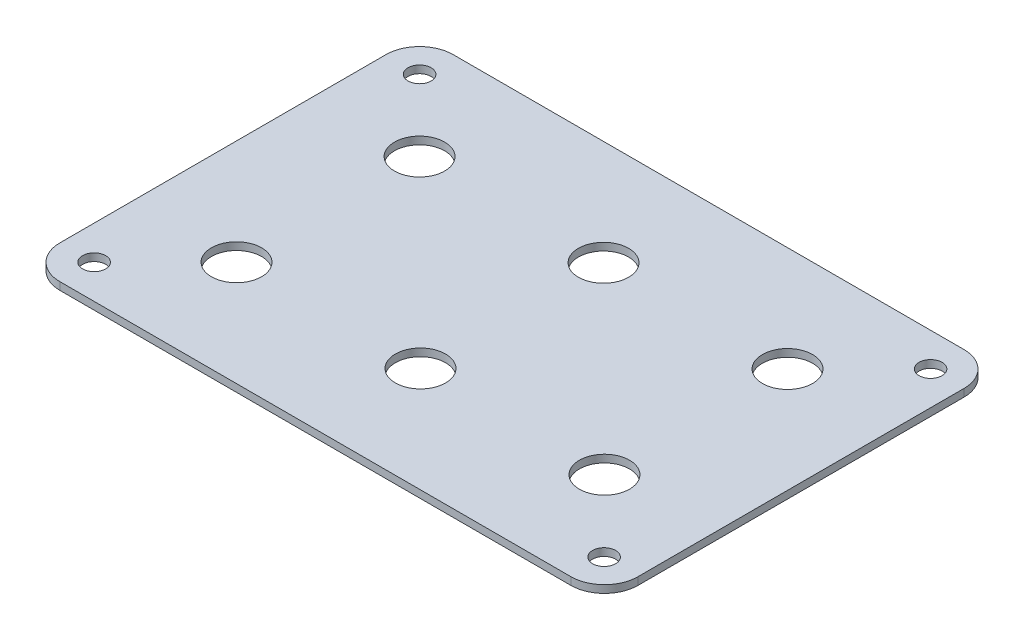
ISO-10303-21;
HEADER;
FILE_DESCRIPTION(('STEP AP214'),'2;1');
FILE_NAME('part.step','',(''),(''),'','','');
FILE_SCHEMA(('AUTOMOTIVE_DESIGN { 1 0 10303 214 1 1 1 1 }'));
ENDSEC;
DATA;
#1=APPLICATION_CONTEXT('core data for automotive mechanical design processes');
#2=APPLICATION_PROTOCOL_DEFINITION('international standard','automotive_design',2000,#1);
#3=PRODUCT_CONTEXT('',#1,'mechanical');
#4=PRODUCT('Part','Part','',(#3));
#5=PRODUCT_RELATED_PRODUCT_CATEGORY('part','',(#4));
#6=PRODUCT_DEFINITION_FORMATION('','',#4);
#7=PRODUCT_DEFINITION_CONTEXT('part definition',#1,'design');
#8=PRODUCT_DEFINITION('design','',#6,#7);
#9=PRODUCT_DEFINITION_SHAPE('','',#8);
#10=(LENGTH_UNIT() NAMED_UNIT(*) SI_UNIT(.MILLI.,.METRE.));
#11=(NAMED_UNIT(*) PLANE_ANGLE_UNIT() SI_UNIT($,.RADIAN.));
#12=(NAMED_UNIT(*) SI_UNIT($,.STERADIAN.) SOLID_ANGLE_UNIT());
#13=UNCERTAINTY_MEASURE_WITH_UNIT(LENGTH_MEASURE(1.E-05),#10,'distance_accuracy_value','');
#14=(GEOMETRIC_REPRESENTATION_CONTEXT(3) GLOBAL_UNCERTAINTY_ASSIGNED_CONTEXT((#13)) GLOBAL_UNIT_ASSIGNED_CONTEXT((#10,
#11,#12)) REPRESENTATION_CONTEXT('',''));
#15=CARTESIAN_POINT('',(0.,0.,0.));
#16=DIRECTION('',(0.,0.,1.));
#17=DIRECTION('',(1.,0.,0.));
#18=AXIS2_PLACEMENT_3D('',#15,#16,#17);
#19=CARTESIAN_POINT('',(314.625,3.175,-393.414993286133));
#20=DIRECTION('',(0.,1.,0.));
#21=DIRECTION('',(0.,0.,1.));
#22=AXIS2_PLACEMENT_3D('',#19,#20,#21);
#23=PLANE('',#22);
#24=CARTESIAN_POINT('',(304.570007324219,3.175,-403.329986572266));
#25=DIRECTION('',(0.,1.,0.));
#26=DIRECTION('',(0.,0.,1.));
#27=AXIS2_PLACEMENT_3D('',#24,#25,#26);
#28=CIRCLE('',#27,4.82000732421872);
#29=CARTESIAN_POINT('',(304.570007324219,3.175,-398.509979248047));
#30=VERTEX_POINT('',#29);
#31=EDGE_CURVE('E241',#30,#30,#28,.T.);
#32=ORIENTED_EDGE('',*,*,#31,.F.);
#33=EDGE_LOOP('',(#32));
#34=FACE_BOUND('',#33,.T.);
#35=CARTESIAN_POINT('',(91.2200012207031,3.175,-539.53999710083));
#36=DIRECTION('',(0.,1.,0.));
#37=DIRECTION('',(0.,0.,1.));
#38=AXIS2_PLACEMENT_3D('',#35,#36,#37);
#39=CIRCLE('',#38,4.81999778747634);
#40=CARTESIAN_POINT('',(91.2200012207031,3.175,-534.719999313354));
#41=VERTEX_POINT('',#40);
#42=EDGE_CURVE('E253',#41,#41,#39,.T.);
#43=ORIENTED_EDGE('',*,*,#42,.F.);
#44=EDGE_LOOP('',(#43));
#45=FACE_BOUND('',#44,.T.);
#46=CARTESIAN_POINT('',(197.889999389649,3.175,-433.239990234375));
#47=DIRECTION('',(0.,1.,0.));
#48=DIRECTION('',(0.,0.,1.));
#49=AXIS2_PLACEMENT_3D('',#46,#47,#48);
#50=CIRCLE('',#49,10.4899978637699);
#51=CARTESIAN_POINT('',(197.889999389649,3.175,-422.749992370605));
#52=VERTEX_POINT('',#51);
#53=EDGE_CURVE('E265',#52,#52,#50,.T.);
#54=ORIENTED_EDGE('',*,*,#53,.F.);
#55=EDGE_LOOP('',(#54));
#56=FACE_BOUND('',#55,.T.);
#57=CARTESIAN_POINT('',(274.809997558594,3.175,-509.769989013672));
#58=DIRECTION('',(0.,1.,0.));
#59=DIRECTION('',(0.,0.,1.));
#60=AXIS2_PLACEMENT_3D('',#57,#58,#59);
#61=CIRCLE('',#60,10.489990234375);
#62=CARTESIAN_POINT('',(274.809997558594,3.175,-499.279998779297));
#63=VERTEX_POINT('',#62);
#64=EDGE_CURVE('E277',#63,#63,#61,.T.);
#65=ORIENTED_EDGE('',*,*,#64,.F.);
#66=EDGE_LOOP('',(#65));
#67=FACE_BOUND('',#66,.T.);
#68=CARTESIAN_POINT('',(120.980003356934,3.175,-509.769989013672));
#69=DIRECTION('',(0.,1.,0.));
#70=DIRECTION('',(0.,0.,1.));
#71=AXIS2_PLACEMENT_3D('',#68,#69,#70);
#72=CIRCLE('',#71,10.4899940490722);
#73=CARTESIAN_POINT('',(120.980003356934,3.175,-499.2799949646));
#74=VERTEX_POINT('',#73);
#75=EDGE_CURVE('E289',#74,#74,#72,.T.);
#76=ORIENTED_EDGE('',*,*,#75,.F.);
#77=EDGE_LOOP('',(#76));
#78=FACE_BOUND('',#77,.T.);
#79=CARTESIAN_POINT('',(304.690002441406,3.175,-389.299987792969));
#80=CARTESIAN_POINT('',(312.450012207031,3.175,-389.299987792969));
#81=CARTESIAN_POINT('',(318.739990234375,3.175,-395.589996337891));
#82=CARTESIAN_POINT('',(318.739990234375,3.175,-403.350006103516));
#83=B_SPLINE_CURVE_WITH_KNOTS('',3,(#79,#80,#81,#82),.UNSPECIFIED.,.F.,.F.,(4,4),(7.,8.),.UNSPECIFIED.);
#84=CARTESIAN_POINT('',(304.690002441406,3.175,-389.299987792969));
#85=VERTEX_POINT('',#84);
#86=CARTESIAN_POINT('',(318.739990234375,3.175,-403.350006103516));
#87=VERTEX_POINT('',#86);
#88=EDGE_CURVE('E294',#85,#87,#83,.T.);
#89=ORIENTED_EDGE('',*,*,#88,.T.);
#90=DIRECTION('',(0.,0.,-1.));
#91=VECTOR('',#90,1.);
#92=CARTESIAN_POINT('',(318.739990234375,3.175,-539.660003662109));
#93=LINE('',#92,#91);
#94=CARTESIAN_POINT('',(318.739990234375,3.175,-539.660003662109));
#95=VERTEX_POINT('',#94);
#96=EDGE_CURVE('E94',#87,#95,#93,.T.);
#97=ORIENTED_EDGE('',*,*,#96,.T.);
#98=CARTESIAN_POINT('',(318.739990234375,3.175,-539.660003662109));
#99=CARTESIAN_POINT('',(318.739990234375,3.175,-547.420013427734));
#100=CARTESIAN_POINT('',(312.450012207031,3.175,-553.710006713867));
#101=CARTESIAN_POINT('',(304.690002441406,3.175,-553.710006713867));
#102=B_SPLINE_CURVE_WITH_KNOTS('',3,(#98,#99,#100,#101),.UNSPECIFIED.,.F.,.F.,(4,4),(5.,6.),.UNSPECIFIED.);
#103=CARTESIAN_POINT('',(304.690002441406,3.175,-553.710006713867));
#104=VERTEX_POINT('',#103);
#105=EDGE_CURVE('E160',#95,#104,#102,.T.);
#106=ORIENTED_EDGE('',*,*,#105,.T.);
#107=DIRECTION('',(-1.,0.,0.));
#108=VECTOR('',#107,1.);
#109=CARTESIAN_POINT('',(91.0899963378906,3.175,-553.710006713867));
#110=LINE('',#109,#108);
#111=CARTESIAN_POINT('',(91.0899963378906,3.175,-553.710006713867));
#112=VERTEX_POINT('',#111);
#113=EDGE_CURVE('E155',#104,#112,#110,.T.);
#114=ORIENTED_EDGE('',*,*,#113,.T.);
#115=CARTESIAN_POINT('',(91.0899963378906,3.175,-553.710006713867));
#116=CARTESIAN_POINT('',(83.3299942016602,3.175,-553.710006713867));
#117=CARTESIAN_POINT('',(77.0399932861328,3.175,-547.419998168945));
#118=CARTESIAN_POINT('',(77.0399932861328,3.175,-539.660003662109));
#119=B_SPLINE_CURVE_WITH_KNOTS('',3,(#115,#116,#117,#118),.UNSPECIFIED.,.F.,.F.,(4,4),(3.,4.),.UNSPECIFIED.);
#120=CARTESIAN_POINT('',(77.0399932861328,3.175,-539.660003662109));
#121=VERTEX_POINT('',#120);
#122=EDGE_CURVE('E113',#112,#121,#119,.T.);
#123=ORIENTED_EDGE('',*,*,#122,.T.);
#124=DIRECTION('',(0.,0.,1.));
#125=VECTOR('',#124,1.);
#126=CARTESIAN_POINT('',(77.0399932861328,3.175,-403.349975585938));
#127=LINE('',#126,#125);
#128=CARTESIAN_POINT('',(77.0399932861328,3.175,-403.349975585938));
#129=VERTEX_POINT('',#128);
#130=EDGE_CURVE('E107',#121,#129,#127,.T.);
#131=ORIENTED_EDGE('',*,*,#130,.T.);
#132=CARTESIAN_POINT('',(77.0399932861328,3.175,-403.349975585938));
#133=CARTESIAN_POINT('',(77.0399932861328,3.175,-395.589996337891));
#134=CARTESIAN_POINT('',(83.3299942016602,3.175,-389.299987792969));
#135=CARTESIAN_POINT('',(91.0899963378906,3.175,-389.299987792969));
#136=B_SPLINE_CURVE_WITH_KNOTS('',3,(#132,#133,#134,#135),.UNSPECIFIED.,.F.,.F.,(4,4),(1.,2.),.UNSPECIFIED.);
#137=CARTESIAN_POINT('',(91.0899963378906,3.175,-389.299987792969));
#138=VERTEX_POINT('',#137);
#139=EDGE_CURVE('E111',#129,#138,#136,.T.);
#140=ORIENTED_EDGE('',*,*,#139,.T.);
#141=DIRECTION('',(1.,0.,0.));
#142=VECTOR('',#141,1.);
#143=CARTESIAN_POINT('',(304.690002441406,3.175,-389.299987792969));
#144=LINE('',#143,#142);
#145=EDGE_CURVE('E51',#138,#85,#144,.T.);
#146=ORIENTED_EDGE('',*,*,#145,.T.);
#147=EDGE_LOOP('',(#89,#97,#106,#114,#123,#131,#140,#146));
#148=FACE_BOUND('',#147,.T.);
#149=CARTESIAN_POINT('',(197.889999389649,3.175,-509.769989013672));
#150=DIRECTION('',(0.,1.,0.));
#151=DIRECTION('',(0.,0.,1.));
#152=AXIS2_PLACEMENT_3D('',#149,#150,#151);
#153=CIRCLE('',#152,10.4899978637699);
#154=CARTESIAN_POINT('',(197.889999389649,3.175,-499.279991149902));
#155=VERTEX_POINT('',#154);
#156=EDGE_CURVE('E283',#155,#155,#153,.T.);
#157=ORIENTED_EDGE('',*,*,#156,.F.);
#158=EDGE_LOOP('',(#157));
#159=FACE_BOUND('',#158,.T.);
#160=CARTESIAN_POINT('',(120.980003356934,3.175,-433.239990234375));
#161=DIRECTION('',(0.,1.,0.));
#162=DIRECTION('',(0.,0.,1.));
#163=AXIS2_PLACEMENT_3D('',#160,#161,#162);
#164=CIRCLE('',#163,10.4899940490722);
#165=CARTESIAN_POINT('',(120.980003356934,3.175,-422.749996185303));
#166=VERTEX_POINT('',#165);
#167=EDGE_CURVE('E271',#166,#166,#164,.T.);
#168=ORIENTED_EDGE('',*,*,#167,.F.);
#169=EDGE_LOOP('',(#168));
#170=FACE_BOUND('',#169,.T.);
#171=CARTESIAN_POINT('',(274.809997558594,3.175,-433.239990234375));
#172=DIRECTION('',(0.,1.,0.));
#173=DIRECTION('',(0.,0.,1.));
#174=AXIS2_PLACEMENT_3D('',#171,#172,#173);
#175=CIRCLE('',#174,10.489990234375);
#176=CARTESIAN_POINT('',(274.809997558594,3.175,-422.75));
#177=VERTEX_POINT('',#176);
#178=EDGE_CURVE('E259',#177,#177,#175,.T.);
#179=ORIENTED_EDGE('',*,*,#178,.F.);
#180=EDGE_LOOP('',(#179));
#181=FACE_BOUND('',#180,.T.);
#182=CARTESIAN_POINT('',(91.2200012207031,3.175,-403.480010986328));
#183=DIRECTION('',(0.,1.,0.));
#184=DIRECTION('',(0.,0.,1.));
#185=AXIS2_PLACEMENT_3D('',#182,#183,#184);
#186=CIRCLE('',#185,4.82000350952148);
#187=CARTESIAN_POINT('',(91.2200012207031,3.175,-398.660007476807));
#188=VERTEX_POINT('',#187);
#189=EDGE_CURVE('E247',#188,#188,#186,.T.);
#190=ORIENTED_EDGE('',*,*,#189,.F.);
#191=EDGE_LOOP('',(#190));
#192=FACE_BOUND('',#191,.T.);
#193=CARTESIAN_POINT('',(304.709991455078,3.175,-539.679992675781));
#194=DIRECTION('',(0.,1.,0.));
#195=DIRECTION('',(0.,0.,1.));
#196=AXIS2_PLACEMENT_3D('',#193,#194,#195);
#197=CIRCLE('',#196,4.82000732421872);
#198=CARTESIAN_POINT('',(304.709991455078,3.175,-534.859985351562));
#199=VERTEX_POINT('',#198);
#200=EDGE_CURVE('E232',#199,#199,#197,.T.);
#201=ORIENTED_EDGE('',*,*,#200,.F.);
#202=EDGE_LOOP('',(#201));
#203=FACE_BOUND('',#202,.T.);
#204=ADVANCED_FACE('F33',(#34,#45,#56,#67,#78,#148,#159,#170,#181,#192,#203),#23,.T.);
#205=CARTESIAN_POINT('',(314.625,0.,-393.414993286133));
#206=DIRECTION('',(0.,1.,0.));
#207=DIRECTION('',(0.,0.,1.));
#208=AXIS2_PLACEMENT_3D('',#205,#206,#207);
#209=PLANE('',#208);
#210=CARTESIAN_POINT('',(304.690002441406,0.,-389.299987792969));
#211=CARTESIAN_POINT('',(312.450012207031,0.,-389.299987792969));
#212=CARTESIAN_POINT('',(318.739990234375,0.,-395.589996337891));
#213=CARTESIAN_POINT('',(318.739990234375,0.,-403.350006103516));
#214=B_SPLINE_CURVE_WITH_KNOTS('',3,(#210,#211,#212,#213),.UNSPECIFIED.,.F.,.F.,(4,4),(7.,8.),.UNSPECIFIED.);
#215=CARTESIAN_POINT('',(304.690002441406,0.,-389.299987792969));
#216=VERTEX_POINT('',#215);
#217=CARTESIAN_POINT('',(318.739990234375,0.,-403.350006103516));
#218=VERTEX_POINT('',#217);
#219=EDGE_CURVE('E292',#216,#218,#214,.T.);
#220=ORIENTED_EDGE('',*,*,#219,.F.);
#221=DIRECTION('',(1.,0.,0.));
#222=VECTOR('',#221,1.);
#223=CARTESIAN_POINT('',(304.690002441406,0.,-389.299987792969));
#224=LINE('',#223,#222);
#225=CARTESIAN_POINT('',(91.0899963378906,0.,-389.299987792969));
#226=VERTEX_POINT('',#225);
#227=EDGE_CURVE('E86',#226,#216,#224,.T.);
#228=ORIENTED_EDGE('',*,*,#227,.F.);
#229=CARTESIAN_POINT('',(77.0399932861328,0.,-403.349975585938));
#230=CARTESIAN_POINT('',(77.0399932861328,0.,-395.589996337891));
#231=CARTESIAN_POINT('',(83.3299942016602,0.,-389.299987792969));
#232=CARTESIAN_POINT('',(91.0899963378906,0.,-389.299987792969));
#233=B_SPLINE_CURVE_WITH_KNOTS('',3,(#229,#230,#231,#232),.UNSPECIFIED.,.F.,.F.,(4,4),(1.,2.),.UNSPECIFIED.);
#234=CARTESIAN_POINT('',(77.0399932861328,0.,-403.349975585938));
#235=VERTEX_POINT('',#234);
#236=EDGE_CURVE('E80',#235,#226,#233,.T.);
#237=ORIENTED_EDGE('',*,*,#236,.F.);
#238=DIRECTION('',(0.,0.,1.));
#239=VECTOR('',#238,1.);
#240=CARTESIAN_POINT('',(77.0399932861328,0.,-403.349975585938));
#241=LINE('',#240,#239);
#242=CARTESIAN_POINT('',(77.0399932861328,0.,-539.660003662109));
#243=VERTEX_POINT('',#242);
#244=EDGE_CURVE('E121',#243,#235,#241,.T.);
#245=ORIENTED_EDGE('',*,*,#244,.F.);
#246=CARTESIAN_POINT('',(91.0899963378906,0.,-553.710006713867));
#247=CARTESIAN_POINT('',(83.3299942016602,0.,-553.710006713867));
#248=CARTESIAN_POINT('',(77.0399932861328,0.,-547.419998168945));
#249=CARTESIAN_POINT('',(77.0399932861328,0.,-539.660003662109));
#250=B_SPLINE_CURVE_WITH_KNOTS('',3,(#246,#247,#248,#249),.UNSPECIFIED.,.F.,.F.,(4,4),(3.,4.),.UNSPECIFIED.);
#251=CARTESIAN_POINT('',(91.0899963378906,0.,-553.710006713867));
#252=VERTEX_POINT('',#251);
#253=EDGE_CURVE('E329',#252,#243,#250,.T.);
#254=ORIENTED_EDGE('',*,*,#253,.F.);
#255=DIRECTION('',(-1.,0.,0.));
#256=VECTOR('',#255,1.);
#257=CARTESIAN_POINT('',(91.0899963378906,0.,-553.710006713867));
#258=LINE('',#257,#256);
#259=CARTESIAN_POINT('',(304.690002441406,0.,-553.710006713867));
#260=VERTEX_POINT('',#259);
#261=EDGE_CURVE('E327',#260,#252,#258,.T.);
#262=ORIENTED_EDGE('',*,*,#261,.F.);
#263=CARTESIAN_POINT('',(318.739990234375,0.,-539.660003662109));
#264=CARTESIAN_POINT('',(318.739990234375,0.,-547.420013427734));
#265=CARTESIAN_POINT('',(312.450012207031,0.,-553.710006713867));
#266=CARTESIAN_POINT('',(304.690002441406,0.,-553.710006713867));
#267=B_SPLINE_CURVE_WITH_KNOTS('',3,(#263,#264,#265,#266),.UNSPECIFIED.,.F.,.F.,(4,4),(5.,6.),.UNSPECIFIED.);
#268=CARTESIAN_POINT('',(318.739990234375,0.,-539.660003662109));
#269=VERTEX_POINT('',#268);
#270=EDGE_CURVE('E321',#269,#260,#267,.T.);
#271=ORIENTED_EDGE('',*,*,#270,.F.);
#272=DIRECTION('',(0.,0.,-1.));
#273=VECTOR('',#272,1.);
#274=CARTESIAN_POINT('',(318.739990234375,0.,-539.660003662109));
#275=LINE('',#274,#273);
#276=EDGE_CURVE('E325',#218,#269,#275,.T.);
#277=ORIENTED_EDGE('',*,*,#276,.F.);
#278=EDGE_LOOP('',(#220,#228,#237,#245,#254,#262,#271,#277));
#279=FACE_BOUND('',#278,.T.);
#280=CARTESIAN_POINT('',(120.980003356934,0.,-509.769989013672));
#281=DIRECTION('',(0.,1.,0.));
#282=DIRECTION('',(0.,0.,1.));
#283=AXIS2_PLACEMENT_3D('',#280,#281,#282);
#284=CIRCLE('',#283,10.4899940490722);
#285=CARTESIAN_POINT('',(120.980003356934,0.,-499.2799949646));
#286=VERTEX_POINT('',#285);
#287=EDGE_CURVE('E286',#286,#286,#284,.T.);
#288=ORIENTED_EDGE('',*,*,#287,.T.);
#289=EDGE_LOOP('',(#288));
#290=FACE_BOUND('',#289,.T.);
#291=CARTESIAN_POINT('',(197.889999389649,0.,-509.769989013672));
#292=DIRECTION('',(0.,1.,0.));
#293=DIRECTION('',(0.,0.,1.));
#294=AXIS2_PLACEMENT_3D('',#291,#292,#293);
#295=CIRCLE('',#294,10.4899978637699);
#296=CARTESIAN_POINT('',(197.889999389649,0.,-499.279991149902));
#297=VERTEX_POINT('',#296);
#298=EDGE_CURVE('E280',#297,#297,#295,.T.);
#299=ORIENTED_EDGE('',*,*,#298,.T.);
#300=EDGE_LOOP('',(#299));
#301=FACE_BOUND('',#300,.T.);
#302=CARTESIAN_POINT('',(274.809997558594,0.,-509.769989013672));
#303=DIRECTION('',(0.,1.,0.));
#304=DIRECTION('',(0.,0.,1.));
#305=AXIS2_PLACEMENT_3D('',#302,#303,#304);
#306=CIRCLE('',#305,10.489990234375);
#307=CARTESIAN_POINT('',(274.809997558594,0.,-499.279998779297));
#308=VERTEX_POINT('',#307);
#309=EDGE_CURVE('E274',#308,#308,#306,.T.);
#310=ORIENTED_EDGE('',*,*,#309,.T.);
#311=EDGE_LOOP('',(#310));
#312=FACE_BOUND('',#311,.T.);
#313=CARTESIAN_POINT('',(120.980003356934,0.,-433.239990234375));
#314=DIRECTION('',(0.,1.,0.));
#315=DIRECTION('',(0.,0.,1.));
#316=AXIS2_PLACEMENT_3D('',#313,#314,#315);
#317=CIRCLE('',#316,10.4899940490722);
#318=CARTESIAN_POINT('',(120.980003356934,0.,-422.749996185303));
#319=VERTEX_POINT('',#318);
#320=EDGE_CURVE('E268',#319,#319,#317,.T.);
#321=ORIENTED_EDGE('',*,*,#320,.T.);
#322=EDGE_LOOP('',(#321));
#323=FACE_BOUND('',#322,.T.);
#324=CARTESIAN_POINT('',(197.889999389649,0.,-433.239990234375));
#325=DIRECTION('',(0.,1.,0.));
#326=DIRECTION('',(0.,0.,1.));
#327=AXIS2_PLACEMENT_3D('',#324,#325,#326);
#328=CIRCLE('',#327,10.4899978637699);
#329=CARTESIAN_POINT('',(197.889999389649,0.,-422.749992370605));
#330=VERTEX_POINT('',#329);
#331=EDGE_CURVE('E262',#330,#330,#328,.T.);
#332=ORIENTED_EDGE('',*,*,#331,.T.);
#333=EDGE_LOOP('',(#332));
#334=FACE_BOUND('',#333,.T.);
#335=CARTESIAN_POINT('',(274.809997558594,0.,-433.239990234375));
#336=DIRECTION('',(0.,1.,0.));
#337=DIRECTION('',(0.,0.,1.));
#338=AXIS2_PLACEMENT_3D('',#335,#336,#337);
#339=CIRCLE('',#338,10.489990234375);
#340=CARTESIAN_POINT('',(274.809997558594,0.,-422.75));
#341=VERTEX_POINT('',#340);
#342=EDGE_CURVE('E256',#341,#341,#339,.T.);
#343=ORIENTED_EDGE('',*,*,#342,.T.);
#344=EDGE_LOOP('',(#343));
#345=FACE_BOUND('',#344,.T.);
#346=CARTESIAN_POINT('',(91.2200012207031,0.,-539.53999710083));
#347=DIRECTION('',(0.,1.,0.));
#348=DIRECTION('',(0.,0.,1.));
#349=AXIS2_PLACEMENT_3D('',#346,#347,#348);
#350=CIRCLE('',#349,4.81999778747634);
#351=CARTESIAN_POINT('',(91.2200012207031,0.,-534.719999313354));
#352=VERTEX_POINT('',#351);
#353=EDGE_CURVE('E250',#352,#352,#350,.T.);
#354=ORIENTED_EDGE('',*,*,#353,.T.);
#355=EDGE_LOOP('',(#354));
#356=FACE_BOUND('',#355,.T.);
#357=CARTESIAN_POINT('',(91.2200012207031,0.,-403.480010986328));
#358=DIRECTION('',(0.,1.,0.));
#359=DIRECTION('',(0.,0.,1.));
#360=AXIS2_PLACEMENT_3D('',#357,#358,#359);
#361=CIRCLE('',#360,4.82000350952148);
#362=CARTESIAN_POINT('',(91.2200012207031,0.,-398.660007476807));
#363=VERTEX_POINT('',#362);
#364=EDGE_CURVE('E244',#363,#363,#361,.T.);
#365=ORIENTED_EDGE('',*,*,#364,.T.);
#366=EDGE_LOOP('',(#365));
#367=FACE_BOUND('',#366,.T.);
#368=CARTESIAN_POINT('',(304.570007324219,0.,-403.329986572266));
#369=DIRECTION('',(0.,1.,0.));
#370=DIRECTION('',(0.,0.,1.));
#371=AXIS2_PLACEMENT_3D('',#368,#369,#370);
#372=CIRCLE('',#371,4.82000732421872);
#373=CARTESIAN_POINT('',(304.570007324219,0.,-398.509979248047));
#374=VERTEX_POINT('',#373);
#375=EDGE_CURVE('E238',#374,#374,#372,.T.);
#376=ORIENTED_EDGE('',*,*,#375,.T.);
#377=EDGE_LOOP('',(#376));
#378=FACE_BOUND('',#377,.T.);
#379=CARTESIAN_POINT('',(304.709991455078,0.,-539.679992675781));
#380=DIRECTION('',(0.,1.,0.));
#381=DIRECTION('',(0.,0.,1.));
#382=AXIS2_PLACEMENT_3D('',#379,#380,#381);
#383=CIRCLE('',#382,4.82000732421872);
#384=CARTESIAN_POINT('',(304.709991455078,0.,-534.859985351562));
#385=VERTEX_POINT('',#384);
#386=EDGE_CURVE('E235',#385,#385,#383,.T.);
#387=ORIENTED_EDGE('',*,*,#386,.T.);
#388=EDGE_LOOP('',(#387));
#389=FACE_BOUND('',#388,.T.);
#390=ADVANCED_FACE('F176',(#279,#290,#301,#312,#323,#334,#345,#356,#367,#378,#389),#209,.F.);
#391=DIRECTION('',(0.,-1.,0.));
#392=VECTOR('',#391,1.);
#393=SURFACE_OF_LINEAR_EXTRUSION('',#83,#392);
#394=ORIENTED_EDGE('',*,*,#219,.T.);
#395=DIRECTION('',(0.,-1.,0.));
#396=VECTOR('',#395,1.);
#397=CARTESIAN_POINT('',(318.739990234375,3.175,-403.350006103516));
#398=LINE('',#397,#396);
#399=EDGE_CURVE('E11',#87,#218,#398,.T.);
#400=ORIENTED_EDGE('',*,*,#399,.F.);
#401=ORIENTED_EDGE('',*,*,#88,.F.);
#402=DIRECTION('',(0.,-1.,0.));
#403=VECTOR('',#402,1.);
#404=CARTESIAN_POINT('',(304.690002441406,3.175,-389.299987792969));
#405=LINE('',#404,#403);
#406=EDGE_CURVE('E127',#85,#216,#405,.T.);
#407=ORIENTED_EDGE('',*,*,#406,.T.);
#408=EDGE_LOOP('',(#394,#400,#401,#407));
#409=FACE_BOUND('',#408,.T.);
#410=ADVANCED_FACE('F35',(#409),#393,.F.);
#411=CARTESIAN_POINT('',(318.739990234375,3.175,-539.660003662109));
#412=DIRECTION('',(-1.,0.,0.));
#413=DIRECTION('',(0.,0.,1.));
#414=AXIS2_PLACEMENT_3D('',#411,#412,#413);
#415=PLANE('',#414);
#416=ORIENTED_EDGE('',*,*,#276,.T.);
#417=DIRECTION('',(0.,-1.,0.));
#418=VECTOR('',#417,1.);
#419=CARTESIAN_POINT('',(318.739990234375,3.175,-539.660003662109));
#420=LINE('',#419,#418);
#421=EDGE_CURVE('E43',#95,#269,#420,.T.);
#422=ORIENTED_EDGE('',*,*,#421,.F.);
#423=ORIENTED_EDGE('',*,*,#96,.F.);
#424=ORIENTED_EDGE('',*,*,#399,.T.);
#425=EDGE_LOOP('',(#416,#422,#423,#424));
#426=FACE_BOUND('',#425,.T.);
#427=ADVANCED_FACE('F170',(#426),#415,.F.);
#428=DIRECTION('',(0.,-1.,0.));
#429=VECTOR('',#428,1.);
#430=SURFACE_OF_LINEAR_EXTRUSION('',#102,#429);
#431=ORIENTED_EDGE('',*,*,#270,.T.);
#432=DIRECTION('',(0.,-1.,0.));
#433=VECTOR('',#432,1.);
#434=CARTESIAN_POINT('',(304.690002441406,3.175,-553.710006713867));
#435=LINE('',#434,#433);
#436=EDGE_CURVE('E315',#104,#260,#435,.T.);
#437=ORIENTED_EDGE('',*,*,#436,.F.);
#438=ORIENTED_EDGE('',*,*,#105,.F.);
#439=ORIENTED_EDGE('',*,*,#421,.T.);
#440=EDGE_LOOP('',(#431,#437,#438,#439));
#441=FACE_BOUND('',#440,.T.);
#442=ADVANCED_FACE('F168',(#441),#430,.F.);
#443=CARTESIAN_POINT('',(91.0899963378906,3.175,-553.710006713867));
#444=DIRECTION('',(0.,0.,1.));
#445=DIRECTION('',(1.,0.,0.));
#446=AXIS2_PLACEMENT_3D('',#443,#444,#445);
#447=PLANE('',#446);
#448=ORIENTED_EDGE('',*,*,#261,.T.);
#449=DIRECTION('',(0.,-1.,0.));
#450=VECTOR('',#449,1.);
#451=CARTESIAN_POINT('',(91.0899963378906,3.175,-553.710006713867));
#452=LINE('',#451,#450);
#453=EDGE_CURVE('E312',#112,#252,#452,.T.);
#454=ORIENTED_EDGE('',*,*,#453,.F.);
#455=ORIENTED_EDGE('',*,*,#113,.F.);
#456=ORIENTED_EDGE('',*,*,#436,.T.);
#457=EDGE_LOOP('',(#448,#454,#455,#456));
#458=FACE_BOUND('',#457,.T.);
#459=ADVANCED_FACE('F148',(#458),#447,.F.);
#460=DIRECTION('',(0.,-1.,0.));
#461=VECTOR('',#460,1.);
#462=SURFACE_OF_LINEAR_EXTRUSION('',#119,#461);
#463=ORIENTED_EDGE('',*,*,#253,.T.);
#464=DIRECTION('',(0.,-1.,0.));
#465=VECTOR('',#464,1.);
#466=CARTESIAN_POINT('',(77.0399932861328,3.175,-539.660003662109));
#467=LINE('',#466,#465);
#468=EDGE_CURVE('E122',#121,#243,#467,.T.);
#469=ORIENTED_EDGE('',*,*,#468,.F.);
#470=ORIENTED_EDGE('',*,*,#122,.F.);
#471=ORIENTED_EDGE('',*,*,#453,.T.);
#472=EDGE_LOOP('',(#463,#469,#470,#471));
#473=FACE_BOUND('',#472,.T.);
#474=ADVANCED_FACE('F145',(#473),#462,.F.);
#475=CARTESIAN_POINT('',(77.0399932861328,3.175,-403.349975585938));
#476=DIRECTION('',(1.,0.,0.));
#477=DIRECTION('',(0.,0.,-1.));
#478=AXIS2_PLACEMENT_3D('',#475,#476,#477);
#479=PLANE('',#478);
#480=ORIENTED_EDGE('',*,*,#244,.T.);
#481=DIRECTION('',(0.,-1.,0.));
#482=VECTOR('',#481,1.);
#483=CARTESIAN_POINT('',(77.0399932861328,3.175,-403.349975585938));
#484=LINE('',#483,#482);
#485=EDGE_CURVE('E118',#129,#235,#484,.T.);
#486=ORIENTED_EDGE('',*,*,#485,.F.);
#487=ORIENTED_EDGE('',*,*,#130,.F.);
#488=ORIENTED_EDGE('',*,*,#468,.T.);
#489=EDGE_LOOP('',(#480,#486,#487,#488));
#490=FACE_BOUND('',#489,.T.);
#491=ADVANCED_FACE('F119',(#490),#479,.F.);
#492=DIRECTION('',(0.,-1.,0.));
#493=VECTOR('',#492,1.);
#494=SURFACE_OF_LINEAR_EXTRUSION('',#136,#493);
#495=ORIENTED_EDGE('',*,*,#236,.T.);
#496=DIRECTION('',(0.,-1.,0.));
#497=VECTOR('',#496,1.);
#498=CARTESIAN_POINT('',(91.0899963378906,3.175,-389.299987792969));
#499=LINE('',#498,#497);
#500=EDGE_CURVE('E123',#138,#226,#499,.T.);
#501=ORIENTED_EDGE('',*,*,#500,.F.);
#502=ORIENTED_EDGE('',*,*,#139,.F.);
#503=ORIENTED_EDGE('',*,*,#485,.T.);
#504=EDGE_LOOP('',(#495,#501,#502,#503));
#505=FACE_BOUND('',#504,.T.);
#506=ADVANCED_FACE('F125',(#505),#494,.F.);
#507=CARTESIAN_POINT('',(304.690002441406,3.175,-389.299987792969));
#508=DIRECTION('',(0.,0.,-1.));
#509=DIRECTION('',(-1.,0.,0.));
#510=AXIS2_PLACEMENT_3D('',#507,#508,#509);
#511=PLANE('',#510);
#512=ORIENTED_EDGE('',*,*,#227,.T.);
#513=ORIENTED_EDGE('',*,*,#406,.F.);
#514=ORIENTED_EDGE('',*,*,#145,.F.);
#515=ORIENTED_EDGE('',*,*,#500,.T.);
#516=EDGE_LOOP('',(#512,#513,#514,#515));
#517=FACE_BOUND('',#516,.T.);
#518=ADVANCED_FACE('F141',(#517),#511,.F.);
#519=CARTESIAN_POINT('',(120.980003356934,3.175,-509.769989013672));
#520=DIRECTION('',(0.,-1.,0.));
#521=DIRECTION('',(0.,0.,-1.));
#522=AXIS2_PLACEMENT_3D('',#519,#520,#521);
#523=CYLINDRICAL_SURFACE('',#522,10.4899940490722);
#524=ORIENTED_EDGE('',*,*,#75,.T.);
#525=EDGE_LOOP('',(#524));
#526=FACE_BOUND('',#525,.T.);
#527=ORIENTED_EDGE('',*,*,#287,.F.);
#528=EDGE_LOOP('',(#527));
#529=FACE_BOUND('',#528,.T.);
#530=ADVANCED_FACE('F188',(#526,#529),#523,.F.);
#531=CARTESIAN_POINT('',(197.889999389649,3.175,-509.769989013672));
#532=DIRECTION('',(0.,-1.,0.));
#533=DIRECTION('',(0.,0.,-1.));
#534=AXIS2_PLACEMENT_3D('',#531,#532,#533);
#535=CYLINDRICAL_SURFACE('',#534,10.4899978637699);
#536=ORIENTED_EDGE('',*,*,#156,.T.);
#537=EDGE_LOOP('',(#536));
#538=FACE_BOUND('',#537,.T.);
#539=ORIENTED_EDGE('',*,*,#298,.F.);
#540=EDGE_LOOP('',(#539));
#541=FACE_BOUND('',#540,.T.);
#542=ADVANCED_FACE('F191',(#538,#541),#535,.F.);
#543=CARTESIAN_POINT('',(274.809997558594,3.175,-509.769989013672));
#544=DIRECTION('',(0.,-1.,0.));
#545=DIRECTION('',(0.,0.,-1.));
#546=AXIS2_PLACEMENT_3D('',#543,#544,#545);
#547=CYLINDRICAL_SURFACE('',#546,10.489990234375);
#548=ORIENTED_EDGE('',*,*,#64,.T.);
#549=EDGE_LOOP('',(#548));
#550=FACE_BOUND('',#549,.T.);
#551=ORIENTED_EDGE('',*,*,#309,.F.);
#552=EDGE_LOOP('',(#551));
#553=FACE_BOUND('',#552,.T.);
#554=ADVANCED_FACE('F195',(#550,#553),#547,.F.);
#555=CARTESIAN_POINT('',(120.980003356934,3.175,-433.239990234375));
#556=DIRECTION('',(0.,-1.,0.));
#557=DIRECTION('',(0.,0.,-1.));
#558=AXIS2_PLACEMENT_3D('',#555,#556,#557);
#559=CYLINDRICAL_SURFACE('',#558,10.4899940490722);
#560=ORIENTED_EDGE('',*,*,#167,.T.);
#561=EDGE_LOOP('',(#560));
#562=FACE_BOUND('',#561,.T.);
#563=ORIENTED_EDGE('',*,*,#320,.F.);
#564=EDGE_LOOP('',(#563));
#565=FACE_BOUND('',#564,.T.);
#566=ADVANCED_FACE('F199',(#562,#565),#559,.F.);
#567=CARTESIAN_POINT('',(197.889999389649,3.175,-433.239990234375));
#568=DIRECTION('',(0.,-1.,0.));
#569=DIRECTION('',(0.,0.,-1.));
#570=AXIS2_PLACEMENT_3D('',#567,#568,#569);
#571=CYLINDRICAL_SURFACE('',#570,10.4899978637699);
#572=ORIENTED_EDGE('',*,*,#53,.T.);
#573=EDGE_LOOP('',(#572));
#574=FACE_BOUND('',#573,.T.);
#575=ORIENTED_EDGE('',*,*,#331,.F.);
#576=EDGE_LOOP('',(#575));
#577=FACE_BOUND('',#576,.T.);
#578=ADVANCED_FACE('F203',(#574,#577),#571,.F.);
#579=CARTESIAN_POINT('',(274.809997558594,3.175,-433.239990234375));
#580=DIRECTION('',(0.,-1.,0.));
#581=DIRECTION('',(0.,0.,-1.));
#582=AXIS2_PLACEMENT_3D('',#579,#580,#581);
#583=CYLINDRICAL_SURFACE('',#582,10.489990234375);
#584=ORIENTED_EDGE('',*,*,#178,.T.);
#585=EDGE_LOOP('',(#584));
#586=FACE_BOUND('',#585,.T.);
#587=ORIENTED_EDGE('',*,*,#342,.F.);
#588=EDGE_LOOP('',(#587));
#589=FACE_BOUND('',#588,.T.);
#590=ADVANCED_FACE('F207',(#586,#589),#583,.F.);
#591=CARTESIAN_POINT('',(91.2200012207031,3.175,-539.53999710083));
#592=DIRECTION('',(0.,-1.,0.));
#593=DIRECTION('',(0.,0.,-1.));
#594=AXIS2_PLACEMENT_3D('',#591,#592,#593);
#595=CYLINDRICAL_SURFACE('',#594,4.81999778747634);
#596=ORIENTED_EDGE('',*,*,#42,.T.);
#597=EDGE_LOOP('',(#596));
#598=FACE_BOUND('',#597,.T.);
#599=ORIENTED_EDGE('',*,*,#353,.F.);
#600=EDGE_LOOP('',(#599));
#601=FACE_BOUND('',#600,.T.);
#602=ADVANCED_FACE('F211',(#598,#601),#595,.F.);
#603=CARTESIAN_POINT('',(91.2200012207031,3.175,-403.480010986328));
#604=DIRECTION('',(0.,-1.,0.));
#605=DIRECTION('',(0.,0.,-1.));
#606=AXIS2_PLACEMENT_3D('',#603,#604,#605);
#607=CYLINDRICAL_SURFACE('',#606,4.82000350952148);
#608=ORIENTED_EDGE('',*,*,#189,.T.);
#609=EDGE_LOOP('',(#608));
#610=FACE_BOUND('',#609,.T.);
#611=ORIENTED_EDGE('',*,*,#364,.F.);
#612=EDGE_LOOP('',(#611));
#613=FACE_BOUND('',#612,.T.);
#614=ADVANCED_FACE('F215',(#610,#613),#607,.F.);
#615=CARTESIAN_POINT('',(304.570007324219,3.175,-403.329986572266));
#616=DIRECTION('',(0.,-1.,0.));
#617=DIRECTION('',(0.,0.,-1.));
#618=AXIS2_PLACEMENT_3D('',#615,#616,#617);
#619=CYLINDRICAL_SURFACE('',#618,4.82000732421872);
#620=ORIENTED_EDGE('',*,*,#31,.T.);
#621=EDGE_LOOP('',(#620));
#622=FACE_BOUND('',#621,.T.);
#623=ORIENTED_EDGE('',*,*,#375,.F.);
#624=EDGE_LOOP('',(#623));
#625=FACE_BOUND('',#624,.T.);
#626=ADVANCED_FACE('F219',(#622,#625),#619,.F.);
#627=CARTESIAN_POINT('',(304.709991455078,3.175,-539.679992675781));
#628=DIRECTION('',(0.,-1.,0.));
#629=DIRECTION('',(0.,0.,-1.));
#630=AXIS2_PLACEMENT_3D('',#627,#628,#629);
#631=CYLINDRICAL_SURFACE('',#630,4.82000732421872);
#632=ORIENTED_EDGE('',*,*,#200,.T.);
#633=EDGE_LOOP('',(#632));
#634=FACE_BOUND('',#633,.T.);
#635=ORIENTED_EDGE('',*,*,#386,.F.);
#636=EDGE_LOOP('',(#635));
#637=FACE_BOUND('',#636,.T.);
#638=ADVANCED_FACE('F223',(#634,#637),#631,.F.);
#639=CLOSED_SHELL('',(#204,#390,#410,#427,#442,#459,#474,#491,#506,#518,#530,#542,#554,#566,
#578,#590,#602,#614,#626,#638));
#640=MANIFOLD_SOLID_BREP('B2',#639);
#641=ADVANCED_BREP_SHAPE_REPRESENTATION('',(#18,#640),#14);
#642=SHAPE_DEFINITION_REPRESENTATION(#9,#641);
ENDSEC;
END-ISO-10303-21;
